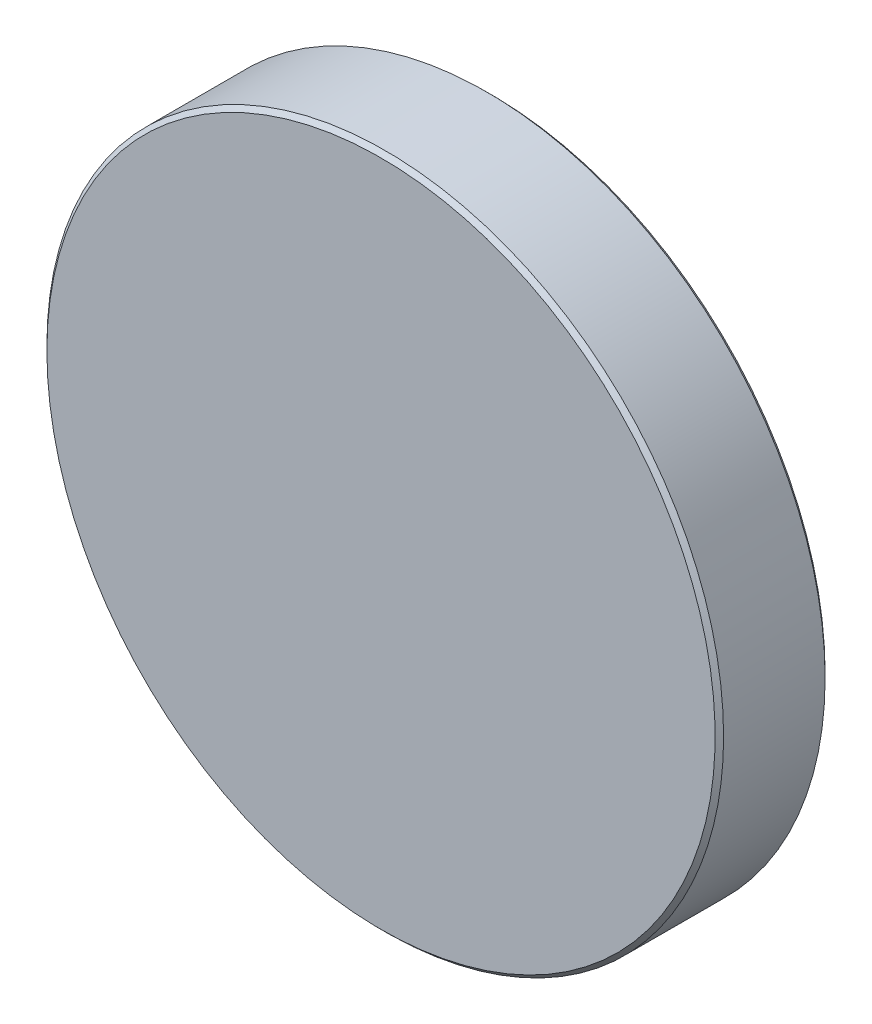
ISO-10303-21;
HEADER;
FILE_DESCRIPTION(('STEP AP214'),'2;1');
FILE_NAME('part.step','',(''),(''),'','','');
FILE_SCHEMA(('AUTOMOTIVE_DESIGN { 1 0 10303 214 1 1 1 1 }'));
ENDSEC;
DATA;
#1=APPLICATION_CONTEXT('core data for automotive mechanical design processes');
#2=APPLICATION_PROTOCOL_DEFINITION('international standard','automotive_design',2000,#1);
#3=PRODUCT_CONTEXT('',#1,'mechanical');
#4=PRODUCT('Part','Part','',(#3));
#5=PRODUCT_RELATED_PRODUCT_CATEGORY('part','',(#4));
#6=PRODUCT_DEFINITION_FORMATION('','',#4);
#7=PRODUCT_DEFINITION_CONTEXT('part definition',#1,'design');
#8=PRODUCT_DEFINITION('design','',#6,#7);
#9=PRODUCT_DEFINITION_SHAPE('','',#8);
#10=(LENGTH_UNIT() NAMED_UNIT(*) SI_UNIT(.MILLI.,.METRE.));
#11=(NAMED_UNIT(*) PLANE_ANGLE_UNIT() SI_UNIT($,.RADIAN.));
#12=(NAMED_UNIT(*) SI_UNIT($,.STERADIAN.) SOLID_ANGLE_UNIT());
#13=UNCERTAINTY_MEASURE_WITH_UNIT(LENGTH_MEASURE(1.E-05),#10,'distance_accuracy_value','');
#14=(GEOMETRIC_REPRESENTATION_CONTEXT(3) GLOBAL_UNCERTAINTY_ASSIGNED_CONTEXT((#13)) GLOBAL_UNIT_ASSIGNED_CONTEXT((#10,
#11,#12)) REPRESENTATION_CONTEXT('',''));
#15=CARTESIAN_POINT('',(0.,0.,0.));
#16=DIRECTION('',(0.,0.,1.));
#17=DIRECTION('',(1.,0.,0.));
#18=AXIS2_PLACEMENT_3D('',#15,#16,#17);
#19=CARTESIAN_POINT('',(0.,0.,-79.95));
#20=DIRECTION('',(0.,0.,-1.));
#21=DIRECTION('',(-1.,0.,0.));
#22=AXIS2_PLACEMENT_3D('',#19,#20,#21);
#23=PLANE('',#22);
#24=CARTESIAN_POINT('',(0.,0.,-79.95));
#25=DIRECTION('',(0.,0.,1.));
#26=DIRECTION('',(1.,0.,0.));
#27=AXIS2_PLACEMENT_3D('',#24,#25,#26);
#28=CIRCLE('',#27,15.8);
#29=CARTESIAN_POINT('',(15.8,0.,-79.95));
#30=VERTEX_POINT('',#29);
#31=EDGE_CURVE('E17',#30,#30,#28,.T.);
#32=ORIENTED_EDGE('',*,*,#31,.F.);
#33=EDGE_LOOP('',(#32));
#34=FACE_BOUND('',#33,.T.);
#35=ADVANCED_FACE('F14',(#34),#23,.T.);
#36=CARTESIAN_POINT('',(0.,0.,-79.75));
#37=DIRECTION('',(0.,0.,1.));
#38=DIRECTION('',(1.,0.,0.));
#39=AXIS2_PLACEMENT_3D('',#36,#37,#38);
#40=CONICAL_SURFACE('',#39,16.,0.785398163397448);
#41=ORIENTED_EDGE('',*,*,#31,.T.);
#42=EDGE_LOOP('',(#41));
#43=FACE_BOUND('',#42,.T.);
#44=CARTESIAN_POINT('',(0.,0.,-79.75));
#45=DIRECTION('',(0.,0.,1.));
#46=DIRECTION('',(1.,0.,0.));
#47=AXIS2_PLACEMENT_3D('',#44,#45,#46);
#48=CIRCLE('',#47,16.);
#49=CARTESIAN_POINT('',(16.,0.,-79.75));
#50=VERTEX_POINT('',#49);
#51=EDGE_CURVE('E25',#50,#50,#48,.T.);
#52=ORIENTED_EDGE('',*,*,#51,.F.);
#53=EDGE_LOOP('',(#52));
#54=FACE_BOUND('',#53,.T.);
#55=ADVANCED_FACE('F34',(#43,#54),#40,.T.);
#56=CARTESIAN_POINT('',(0.,0.,-79.95));
#57=DIRECTION('',(0.,0.,1.));
#58=DIRECTION('',(1.,0.,0.));
#59=AXIS2_PLACEMENT_3D('',#56,#57,#58);
#60=CYLINDRICAL_SURFACE('',#59,16.);
#61=ORIENTED_EDGE('',*,*,#51,.T.);
#62=EDGE_LOOP('',(#61));
#63=FACE_BOUND('',#62,.T.);
#64=CARTESIAN_POINT('',(0.,0.,-74.95));
#65=DIRECTION('',(0.,0.,-1.));
#66=DIRECTION('',(0.880558206777836,-0.473938017546812,0.));
#67=AXIS2_PLACEMENT_3D('',#64,#65,#66);
#68=CIRCLE('',#67,16.);
#69=CARTESIAN_POINT('',(14.0889313084454,-7.58300828074899,-74.95));
#70=VERTEX_POINT('',#69);
#71=EDGE_CURVE('E21',#70,#70,#68,.F.);
#72=ORIENTED_EDGE('',*,*,#71,.F.);
#73=EDGE_LOOP('',(#72));
#74=FACE_BOUND('',#73,.T.);
#75=ADVANCED_FACE('F42',(#63,#74),#60,.T.);
#76=CARTESIAN_POINT('',(0.,0.,-74.95));
#77=DIRECTION('',(0.,0.,-1.));
#78=DIRECTION('',(-1.,0.,0.));
#79=AXIS2_PLACEMENT_3D('',#76,#77,#78);
#80=CONICAL_SURFACE('',#79,16.,0.7853981633975);
#81=CARTESIAN_POINT('',(0.,0.,-74.75));
#82=DIRECTION('',(0.,0.,-1.));
#83=DIRECTION('',(-1.,0.,0.));
#84=AXIS2_PLACEMENT_3D('',#81,#82,#83);
#85=CIRCLE('',#84,15.8);
#86=CARTESIAN_POINT('',(-15.8,0.,-74.75));
#87=VERTEX_POINT('',#86);
#88=EDGE_CURVE('E10',#87,#87,#85,.T.);
#89=ORIENTED_EDGE('',*,*,#88,.T.);
#90=EDGE_LOOP('',(#89));
#91=FACE_BOUND('',#90,.T.);
#92=ORIENTED_EDGE('',*,*,#71,.T.);
#93=EDGE_LOOP('',(#92));
#94=FACE_BOUND('',#93,.T.);
#95=ADVANCED_FACE('F45',(#91,#94),#80,.T.);
#96=CARTESIAN_POINT('',(0.,0.,-74.75));
#97=DIRECTION('',(0.,0.,-1.));
#98=DIRECTION('',(-1.,0.,0.));
#99=AXIS2_PLACEMENT_3D('',#96,#97,#98);
#100=PLANE('',#99);
#101=ORIENTED_EDGE('',*,*,#88,.F.);
#102=EDGE_LOOP('',(#101));
#103=FACE_BOUND('',#102,.T.);
#104=ADVANCED_FACE('F43',(#103),#100,.F.);
#105=CLOSED_SHELL('',(#35,#55,#75,#95,#104));
#106=MANIFOLD_SOLID_BREP('B1',#105);
#107=ADVANCED_BREP_SHAPE_REPRESENTATION('',(#18,#106),#14);
#108=SHAPE_DEFINITION_REPRESENTATION(#9,#107);
ENDSEC;
END-ISO-10303-21;
